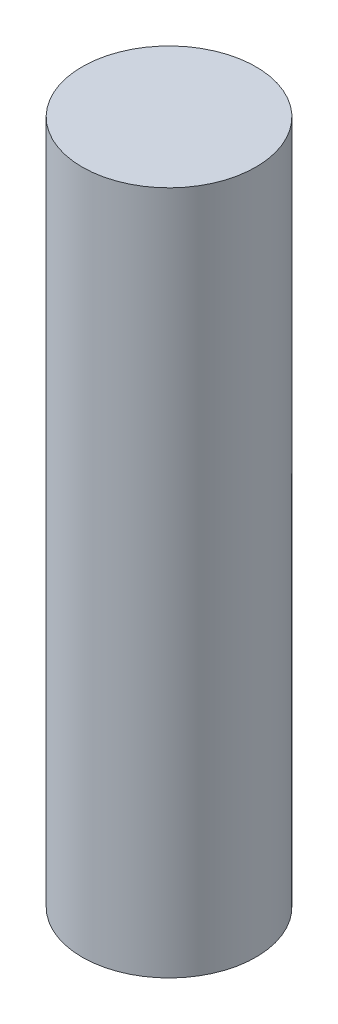
ISO-10303-21;
HEADER;
FILE_DESCRIPTION(('STEP AP214'),'2;1');
FILE_NAME('part.step','',(''),(''),'','','');
FILE_SCHEMA(('AUTOMOTIVE_DESIGN { 1 0 10303 214 1 1 1 1 }'));
ENDSEC;
DATA;
#1=APPLICATION_CONTEXT('core data for automotive mechanical design processes');
#2=APPLICATION_PROTOCOL_DEFINITION('international standard','automotive_design',2000,#1);
#3=PRODUCT_CONTEXT('',#1,'mechanical');
#4=PRODUCT('Part','Part','',(#3));
#5=PRODUCT_RELATED_PRODUCT_CATEGORY('part','',(#4));
#6=PRODUCT_DEFINITION_FORMATION('','',#4);
#7=PRODUCT_DEFINITION_CONTEXT('part definition',#1,'design');
#8=PRODUCT_DEFINITION('design','',#6,#7);
#9=PRODUCT_DEFINITION_SHAPE('','',#8);
#10=(LENGTH_UNIT() NAMED_UNIT(*) SI_UNIT(.MILLI.,.METRE.));
#11=(NAMED_UNIT(*) PLANE_ANGLE_UNIT() SI_UNIT($,.RADIAN.));
#12=(NAMED_UNIT(*) SI_UNIT($,.STERADIAN.) SOLID_ANGLE_UNIT());
#13=UNCERTAINTY_MEASURE_WITH_UNIT(LENGTH_MEASURE(1.E-05),#10,'distance_accuracy_value','');
#14=(GEOMETRIC_REPRESENTATION_CONTEXT(3) GLOBAL_UNCERTAINTY_ASSIGNED_CONTEXT((#13)) GLOBAL_UNIT_ASSIGNED_CONTEXT((#10,
#11,#12)) REPRESENTATION_CONTEXT('',''));
#15=CARTESIAN_POINT('',(0.,0.,0.));
#16=DIRECTION('',(0.,0.,1.));
#17=DIRECTION('',(1.,0.,0.));
#18=AXIS2_PLACEMENT_3D('',#15,#16,#17);
#19=CARTESIAN_POINT('',(-72.8311573284941,200.,-7.01252852667267));
#20=DIRECTION('',(0.,-1.,0.));
#21=DIRECTION('',(0.,0.,-1.));
#22=AXIS2_PLACEMENT_3D('',#19,#20,#21);
#23=CYLINDRICAL_SURFACE('',#22,25.4);
#24=CARTESIAN_POINT('',(-72.8311573284941,200.,-7.01252852667267));
#25=DIRECTION('',(0.,1.,0.));
#26=DIRECTION('',(0.,0.,1.));
#27=AXIS2_PLACEMENT_3D('',#24,#25,#26);
#28=CIRCLE('',#27,25.4);
#29=CARTESIAN_POINT('',(-72.8311573284941,200.,18.3874714733273));
#30=VERTEX_POINT('',#29);
#31=EDGE_CURVE('E10',#30,#30,#28,.T.);
#32=ORIENTED_EDGE('',*,*,#31,.F.);
#33=EDGE_LOOP('',(#32));
#34=FACE_BOUND('',#33,.T.);
#35=CARTESIAN_POINT('',(-72.8311573284941,0.,-7.01252852667267));
#36=DIRECTION('',(0.,1.,0.));
#37=DIRECTION('',(0.,0.,1.));
#38=AXIS2_PLACEMENT_3D('',#35,#36,#37);
#39=CIRCLE('',#38,25.4);
#40=CARTESIAN_POINT('',(-72.8311573284941,0.,18.3874714733273));
#41=VERTEX_POINT('',#40);
#42=EDGE_CURVE('E34',#41,#41,#39,.T.);
#43=ORIENTED_EDGE('',*,*,#42,.T.);
#44=EDGE_LOOP('',(#43));
#45=FACE_BOUND('',#44,.T.);
#46=ADVANCED_FACE('F31',(#34,#45),#23,.T.);
#47=CARTESIAN_POINT('',(-72.8311573284941,200.,-7.01252852667267));
#48=DIRECTION('',(0.,1.,0.));
#49=DIRECTION('',(0.,0.,1.));
#50=AXIS2_PLACEMENT_3D('',#47,#48,#49);
#51=PLANE('',#50);
#52=ORIENTED_EDGE('',*,*,#31,.T.);
#53=EDGE_LOOP('',(#52));
#54=FACE_BOUND('',#53,.T.);
#55=ADVANCED_FACE('F46',(#54),#51,.T.);
#56=CARTESIAN_POINT('',(-72.8311573284941,0.,-7.01252852667267));
#57=DIRECTION('',(0.,1.,0.));
#58=DIRECTION('',(0.,0.,1.));
#59=AXIS2_PLACEMENT_3D('',#56,#57,#58);
#60=PLANE('',#59);
#61=ORIENTED_EDGE('',*,*,#42,.F.);
#62=EDGE_LOOP('',(#61));
#63=FACE_BOUND('',#62,.T.);
#64=ADVANCED_FACE('F44',(#63),#60,.F.);
#65=CLOSED_SHELL('',(#46,#55,#64));
#66=MANIFOLD_SOLID_BREP('B2',#65);
#67=ADVANCED_BREP_SHAPE_REPRESENTATION('',(#18,#66),#14);
#68=SHAPE_DEFINITION_REPRESENTATION(#9,#67);
ENDSEC;
END-ISO-10303-21;
